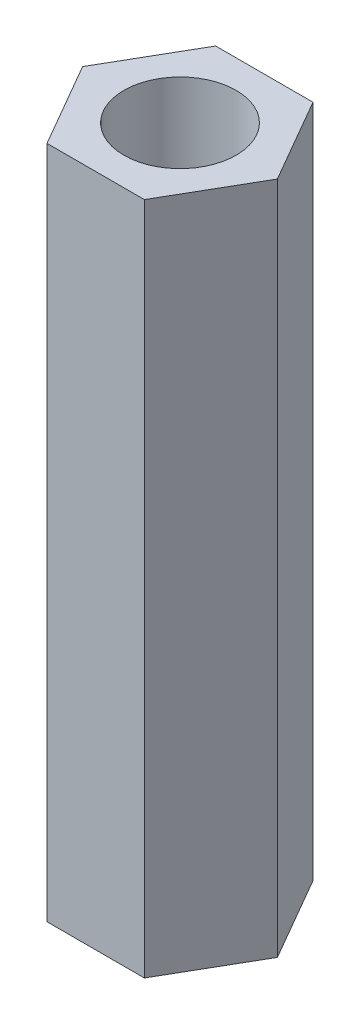
ISO-10303-21;
HEADER;
FILE_DESCRIPTION(('STEP AP214'),'2;1');
FILE_NAME('part.step','',(''),(''),'','','');
FILE_SCHEMA(('AUTOMOTIVE_DESIGN { 1 0 10303 214 1 1 1 1 }'));
ENDSEC;
DATA;
#1=APPLICATION_CONTEXT('core data for automotive mechanical design processes');
#2=APPLICATION_PROTOCOL_DEFINITION('international standard','automotive_design',2000,#1);
#3=PRODUCT_CONTEXT('',#1,'mechanical');
#4=PRODUCT('Part','Part','',(#3));
#5=PRODUCT_RELATED_PRODUCT_CATEGORY('part','',(#4));
#6=PRODUCT_DEFINITION_FORMATION('','',#4);
#7=PRODUCT_DEFINITION_CONTEXT('part definition',#1,'design');
#8=PRODUCT_DEFINITION('design','',#6,#7);
#9=PRODUCT_DEFINITION_SHAPE('','',#8);
#10=(LENGTH_UNIT() NAMED_UNIT(*) SI_UNIT(.MILLI.,.METRE.));
#11=(NAMED_UNIT(*) PLANE_ANGLE_UNIT() SI_UNIT($,.RADIAN.));
#12=(NAMED_UNIT(*) SI_UNIT($,.STERADIAN.) SOLID_ANGLE_UNIT());
#13=UNCERTAINTY_MEASURE_WITH_UNIT(LENGTH_MEASURE(1.E-05),#10,'distance_accuracy_value','');
#14=(GEOMETRIC_REPRESENTATION_CONTEXT(3) GLOBAL_UNCERTAINTY_ASSIGNED_CONTEXT((#13)) GLOBAL_UNIT_ASSIGNED_CONTEXT((#10,
#11,#12)) REPRESENTATION_CONTEXT('',''));
#15=CARTESIAN_POINT('',(0.,0.,0.));
#16=DIRECTION('',(0.,0.,1.));
#17=DIRECTION('',(1.,0.,0.));
#18=AXIS2_PLACEMENT_3D('',#15,#16,#17);
#19=CARTESIAN_POINT('',(0.,18.,0.));
#20=DIRECTION('',(0.,1.,0.));
#21=DIRECTION('',(0.,0.,1.));
#22=AXIS2_PLACEMENT_3D('',#19,#20,#21);
#23=PLANE('',#22);
#24=DIRECTION('',(0.499999999999995,0.,-0.866025403784441));
#25=VECTOR('',#24,1.);
#26=CARTESIAN_POINT('',(1.30000000000003,18.,2.25166604983953));
#27=LINE('',#26,#25);
#28=CARTESIAN_POINT('',(1.30000000000003,18.,2.25166604983953));
#29=VERTEX_POINT('',#28);
#30=CARTESIAN_POINT('',(2.6,18.,0.));
#31=VERTEX_POINT('',#30);
#32=EDGE_CURVE('E139',#29,#31,#27,.T.);
#33=ORIENTED_EDGE('',*,*,#32,.T.);
#34=DIRECTION('',(-0.500000000000001,0.,-0.866025403784438));
#35=VECTOR('',#34,1.);
#36=CARTESIAN_POINT('',(2.6,18.,0.));
#37=LINE('',#36,#35);
#38=CARTESIAN_POINT('',(1.29999999999999,18.,-2.25166604983954));
#39=VERTEX_POINT('',#38);
#40=EDGE_CURVE('E97',#31,#39,#37,.T.);
#41=ORIENTED_EDGE('',*,*,#40,.T.);
#42=DIRECTION('',(-1.,0.,0.));
#43=VECTOR('',#42,1.);
#44=CARTESIAN_POINT('',(1.29999999999999,18.,-2.25166604983954));
#45=LINE('',#44,#43);
#46=CARTESIAN_POINT('',(-1.30000000000001,18.,-2.25166604983953));
#47=VERTEX_POINT('',#46);
#48=EDGE_CURVE('E110',#39,#47,#45,.T.);
#49=ORIENTED_EDGE('',*,*,#48,.T.);
#50=DIRECTION('',(-0.499999999999995,0.,0.866025403784442));
#51=VECTOR('',#50,1.);
#52=CARTESIAN_POINT('',(-1.30000000000001,18.,-2.25166604983953));
#53=LINE('',#52,#51);
#54=CARTESIAN_POINT('',(-2.6,18.,0.));
#55=VERTEX_POINT('',#54);
#56=EDGE_CURVE('E104',#47,#55,#53,.T.);
#57=ORIENTED_EDGE('',*,*,#56,.T.);
#58=DIRECTION('',(0.500000000000007,0.,0.866025403784434));
#59=VECTOR('',#58,1.);
#60=CARTESIAN_POINT('',(-2.6,18.,0.));
#61=LINE('',#60,#59);
#62=CARTESIAN_POINT('',(-1.29999999999998,18.,2.25166604983955));
#63=VERTEX_POINT('',#62);
#64=EDGE_CURVE('E108',#55,#63,#61,.T.);
#65=ORIENTED_EDGE('',*,*,#64,.T.);
#66=DIRECTION('',(1.,0.,0.));
#67=VECTOR('',#66,1.);
#68=CARTESIAN_POINT('',(-1.29999999999998,18.,2.25166604983955));
#69=LINE('',#68,#67);
#70=EDGE_CURVE('E60',#63,#29,#69,.T.);
#71=ORIENTED_EDGE('',*,*,#70,.T.);
#72=EDGE_LOOP('',(#33,#41,#49,#57,#65,#71));
#73=FACE_BOUND('',#72,.T.);
#74=CARTESIAN_POINT('',(0.,18.,0.));
#75=DIRECTION('',(0.,1.,0.));
#76=DIRECTION('',(0.,0.,1.));
#77=AXIS2_PLACEMENT_3D('',#74,#75,#76);
#78=CIRCLE('',#77,1.5);
#79=CARTESIAN_POINT('',(0.,18.,1.5));
#80=VERTEX_POINT('',#79);
#81=EDGE_CURVE('E132',#80,#80,#78,.T.);
#82=ORIENTED_EDGE('',*,*,#81,.F.);
#83=EDGE_LOOP('',(#82));
#84=FACE_BOUND('',#83,.T.);
#85=ADVANCED_FACE('F43',(#73,#84),#23,.T.);
#86=CARTESIAN_POINT('',(0.,0.,0.));
#87=DIRECTION('',(0.,1.,0.));
#88=DIRECTION('',(0.,0.,1.));
#89=AXIS2_PLACEMENT_3D('',#86,#87,#88);
#90=PLANE('',#89);
#91=DIRECTION('',(0.499999999999995,0.,-0.866025403784441));
#92=VECTOR('',#91,1.);
#93=CARTESIAN_POINT('',(1.30000000000003,0.,2.25166604983953));
#94=LINE('',#93,#92);
#95=CARTESIAN_POINT('',(1.30000000000003,0.,2.25166604983953));
#96=VERTEX_POINT('',#95);
#97=CARTESIAN_POINT('',(2.6,0.,0.));
#98=VERTEX_POINT('',#97);
#99=EDGE_CURVE('E128',#96,#98,#94,.T.);
#100=ORIENTED_EDGE('',*,*,#99,.F.);
#101=DIRECTION('',(1.,0.,0.));
#102=VECTOR('',#101,1.);
#103=CARTESIAN_POINT('',(-1.29999999999998,0.,2.25166604983955));
#104=LINE('',#103,#102);
#105=CARTESIAN_POINT('',(-1.29999999999998,0.,2.25166604983955));
#106=VERTEX_POINT('',#105);
#107=EDGE_CURVE('E89',#106,#96,#104,.T.);
#108=ORIENTED_EDGE('',*,*,#107,.F.);
#109=DIRECTION('',(0.500000000000007,0.,0.866025403784434));
#110=VECTOR('',#109,1.);
#111=CARTESIAN_POINT('',(-2.6,0.,0.));
#112=LINE('',#111,#110);
#113=CARTESIAN_POINT('',(-2.6,0.,0.));
#114=VERTEX_POINT('',#113);
#115=EDGE_CURVE('E83',#114,#106,#112,.T.);
#116=ORIENTED_EDGE('',*,*,#115,.F.);
#117=DIRECTION('',(-0.499999999999995,0.,0.866025403784442));
#118=VECTOR('',#117,1.);
#119=CARTESIAN_POINT('',(-1.30000000000001,0.,-2.25166604983953));
#120=LINE('',#119,#118);
#121=CARTESIAN_POINT('',(-1.30000000000001,0.,-2.25166604983953));
#122=VERTEX_POINT('',#121);
#123=EDGE_CURVE('E118',#122,#114,#120,.T.);
#124=ORIENTED_EDGE('',*,*,#123,.F.);
#125=DIRECTION('',(-1.,0.,0.));
#126=VECTOR('',#125,1.);
#127=CARTESIAN_POINT('',(1.29999999999999,0.,-2.25166604983954));
#128=LINE('',#127,#126);
#129=CARTESIAN_POINT('',(1.29999999999999,0.,-2.25166604983954));
#130=VERTEX_POINT('',#129);
#131=EDGE_CURVE('E134',#130,#122,#128,.T.);
#132=ORIENTED_EDGE('',*,*,#131,.F.);
#133=DIRECTION('',(-0.500000000000001,0.,-0.866025403784438));
#134=VECTOR('',#133,1.);
#135=CARTESIAN_POINT('',(2.6,0.,0.));
#136=LINE('',#135,#134);
#137=EDGE_CURVE('E131',#98,#130,#136,.T.);
#138=ORIENTED_EDGE('',*,*,#137,.F.);
#139=EDGE_LOOP('',(#100,#108,#116,#124,#132,#138));
#140=FACE_BOUND('',#139,.T.);
#141=CARTESIAN_POINT('',(0.,0.,0.));
#142=DIRECTION('',(0.,1.,0.));
#143=DIRECTION('',(0.,0.,1.));
#144=AXIS2_PLACEMENT_3D('',#141,#142,#143);
#145=CIRCLE('',#144,1.5);
#146=CARTESIAN_POINT('',(0.,0.,1.5));
#147=VERTEX_POINT('',#146);
#148=EDGE_CURVE('E232',#147,#147,#145,.T.);
#149=ORIENTED_EDGE('',*,*,#148,.T.);
#150=EDGE_LOOP('',(#149));
#151=FACE_BOUND('',#150,.T.);
#152=ADVANCED_FACE('F148',(#140,#151),#90,.F.);
#153=CARTESIAN_POINT('',(1.30000000000003,18.,2.25166604983953));
#154=DIRECTION('',(-0.866025403784441,0.,-0.499999999999995));
#155=DIRECTION('',(-0.499999999999995,0.,0.866025403784442));
#156=AXIS2_PLACEMENT_3D('',#153,#154,#155);
#157=PLANE('',#156);
#158=ORIENTED_EDGE('',*,*,#99,.T.);
#159=DIRECTION('',(0.,-1.,0.));
#160=VECTOR('',#159,1.);
#161=CARTESIAN_POINT('',(2.6,18.,0.));
#162=LINE('',#161,#160);
#163=EDGE_CURVE('E11',#31,#98,#162,.T.);
#164=ORIENTED_EDGE('',*,*,#163,.F.);
#165=ORIENTED_EDGE('',*,*,#32,.F.);
#166=DIRECTION('',(0.,-1.,0.));
#167=VECTOR('',#166,1.);
#168=CARTESIAN_POINT('',(1.30000000000003,18.,2.25166604983953));
#169=LINE('',#168,#167);
#170=EDGE_CURVE('E124',#29,#96,#169,.T.);
#171=ORIENTED_EDGE('',*,*,#170,.T.);
#172=EDGE_LOOP('',(#158,#164,#165,#171));
#173=FACE_BOUND('',#172,.T.);
#174=ADVANCED_FACE('F45',(#173),#157,.F.);
#175=CARTESIAN_POINT('',(2.6,18.,0.));
#176=DIRECTION('',(-0.866025403784438,0.,0.500000000000001));
#177=DIRECTION('',(0.500000000000001,0.,0.866025403784438));
#178=AXIS2_PLACEMENT_3D('',#175,#176,#177);
#179=PLANE('',#178);
#180=ORIENTED_EDGE('',*,*,#137,.T.);
#181=DIRECTION('',(0.,-1.,0.));
#182=VECTOR('',#181,1.);
#183=CARTESIAN_POINT('',(1.29999999999999,18.,-2.25166604983954));
#184=LINE('',#183,#182);
#185=EDGE_CURVE('E52',#39,#130,#184,.T.);
#186=ORIENTED_EDGE('',*,*,#185,.F.);
#187=ORIENTED_EDGE('',*,*,#40,.F.);
#188=ORIENTED_EDGE('',*,*,#163,.T.);
#189=EDGE_LOOP('',(#180,#186,#187,#188));
#190=FACE_BOUND('',#189,.T.);
#191=ADVANCED_FACE('F173',(#190),#179,.F.);
#192=CARTESIAN_POINT('',(1.29999999999999,18.,-2.25166604983954));
#193=DIRECTION('',(0.,0.,1.));
#194=DIRECTION('',(1.,0.,0.));
#195=AXIS2_PLACEMENT_3D('',#192,#193,#194);
#196=PLANE('',#195);
#197=ORIENTED_EDGE('',*,*,#131,.T.);
#198=DIRECTION('',(0.,-1.,0.));
#199=VECTOR('',#198,1.);
#200=CARTESIAN_POINT('',(-1.30000000000001,18.,-2.25166604983953));
#201=LINE('',#200,#199);
#202=EDGE_CURVE('E119',#47,#122,#201,.T.);
#203=ORIENTED_EDGE('',*,*,#202,.F.);
#204=ORIENTED_EDGE('',*,*,#48,.F.);
#205=ORIENTED_EDGE('',*,*,#185,.T.);
#206=EDGE_LOOP('',(#197,#203,#204,#205));
#207=FACE_BOUND('',#206,.T.);
#208=ADVANCED_FACE('F145',(#207),#196,.F.);
#209=CARTESIAN_POINT('',(-1.30000000000001,18.,-2.25166604983953));
#210=DIRECTION('',(0.866025403784442,0.,0.499999999999995));
#211=DIRECTION('',(0.499999999999995,0.,-0.866025403784442));
#212=AXIS2_PLACEMENT_3D('',#209,#210,#211);
#213=PLANE('',#212);
#214=ORIENTED_EDGE('',*,*,#123,.T.);
#215=DIRECTION('',(0.,-1.,0.));
#216=VECTOR('',#215,1.);
#217=CARTESIAN_POINT('',(-2.6,18.,0.));
#218=LINE('',#217,#216);
#219=EDGE_CURVE('E115',#55,#114,#218,.T.);
#220=ORIENTED_EDGE('',*,*,#219,.F.);
#221=ORIENTED_EDGE('',*,*,#56,.F.);
#222=ORIENTED_EDGE('',*,*,#202,.T.);
#223=EDGE_LOOP('',(#214,#220,#221,#222));
#224=FACE_BOUND('',#223,.T.);
#225=ADVANCED_FACE('F116',(#224),#213,.F.);
#226=CARTESIAN_POINT('',(-2.6,18.,0.));
#227=DIRECTION('',(0.866025403784434,0.,-0.500000000000007));
#228=DIRECTION('',(-0.500000000000007,0.,-0.866025403784435));
#229=AXIS2_PLACEMENT_3D('',#226,#227,#228);
#230=PLANE('',#229);
#231=ORIENTED_EDGE('',*,*,#115,.T.);
#232=DIRECTION('',(0.,-1.,0.));
#233=VECTOR('',#232,1.);
#234=CARTESIAN_POINT('',(-1.29999999999998,18.,2.25166604983955));
#235=LINE('',#234,#233);
#236=EDGE_CURVE('E120',#63,#106,#235,.T.);
#237=ORIENTED_EDGE('',*,*,#236,.F.);
#238=ORIENTED_EDGE('',*,*,#64,.F.);
#239=ORIENTED_EDGE('',*,*,#219,.T.);
#240=EDGE_LOOP('',(#231,#237,#238,#239));
#241=FACE_BOUND('',#240,.T.);
#242=ADVANCED_FACE('F122',(#241),#230,.F.);
#243=CARTESIAN_POINT('',(-1.29999999999998,18.,2.25166604983955));
#244=DIRECTION('',(0.,0.,-1.));
#245=DIRECTION('',(-1.,0.,0.));
#246=AXIS2_PLACEMENT_3D('',#243,#244,#245);
#247=PLANE('',#246);
#248=ORIENTED_EDGE('',*,*,#107,.T.);
#249=ORIENTED_EDGE('',*,*,#170,.F.);
#250=ORIENTED_EDGE('',*,*,#70,.F.);
#251=ORIENTED_EDGE('',*,*,#236,.T.);
#252=EDGE_LOOP('',(#248,#249,#250,#251));
#253=FACE_BOUND('',#252,.T.);
#254=ADVANCED_FACE('F153',(#253),#247,.F.);
#255=CARTESIAN_POINT('',(0.,18.,0.));
#256=DIRECTION('',(0.,-1.,0.));
#257=DIRECTION('',(0.,0.,-1.));
#258=AXIS2_PLACEMENT_3D('',#255,#256,#257);
#259=CYLINDRICAL_SURFACE('',#258,1.5);
#260=ORIENTED_EDGE('',*,*,#81,.T.);
#261=EDGE_LOOP('',(#260));
#262=FACE_BOUND('',#261,.T.);
#263=ORIENTED_EDGE('',*,*,#148,.F.);
#264=EDGE_LOOP('',(#263));
#265=FACE_BOUND('',#264,.T.);
#266=ADVANCED_FACE('F155',(#262,#265),#259,.F.);
#267=CLOSED_SHELL('',(#85,#152,#174,#191,#208,#225,#242,#254,#266));
#268=MANIFOLD_SOLID_BREP('B2',#267);
#269=ADVANCED_BREP_SHAPE_REPRESENTATION('',(#18,#268),#14);
#270=SHAPE_DEFINITION_REPRESENTATION(#9,#269);
ENDSEC;
END-ISO-10303-21;
